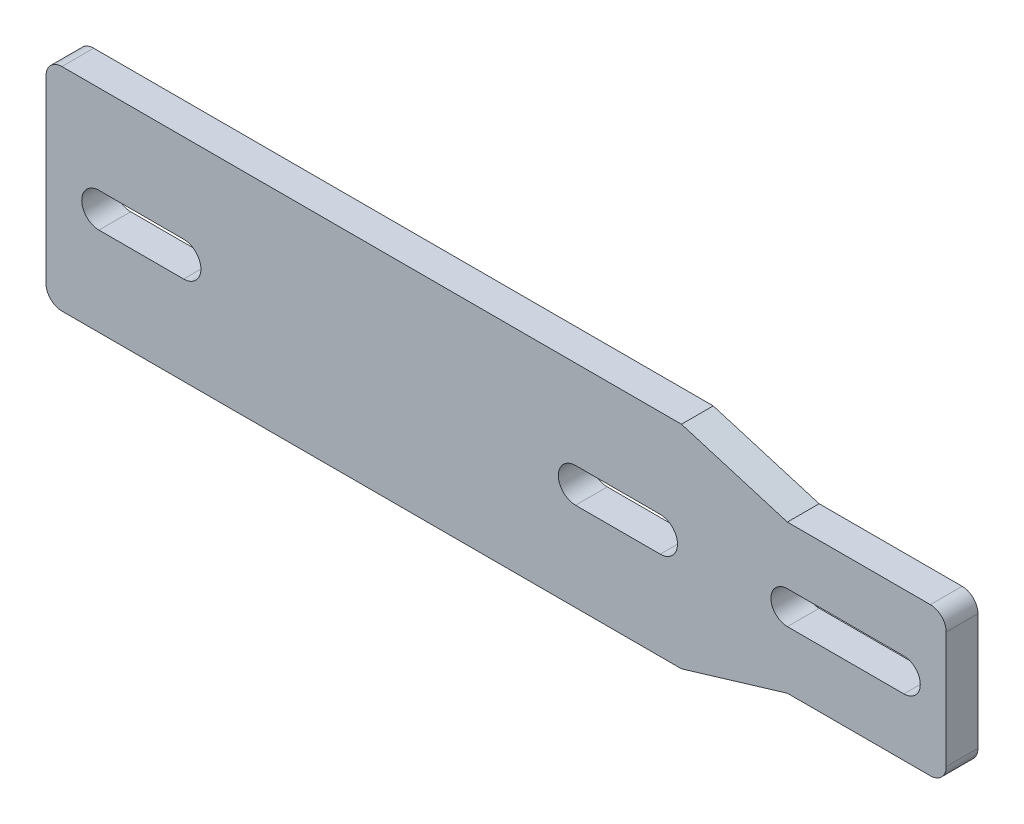
ISO-10303-21;
HEADER;
FILE_DESCRIPTION(('STEP AP214'),'2;1');
FILE_NAME('part.step','',(''),(''),'','','');
FILE_SCHEMA(('AUTOMOTIVE_DESIGN { 1 0 10303 214 1 1 1 1 }'));
ENDSEC;
DATA;
#1=APPLICATION_CONTEXT('core data for automotive mechanical design processes');
#2=APPLICATION_PROTOCOL_DEFINITION('international standard','automotive_design',2000,#1);
#3=PRODUCT_CONTEXT('',#1,'mechanical');
#4=PRODUCT('Part','Part','',(#3));
#5=PRODUCT_RELATED_PRODUCT_CATEGORY('part','',(#4));
#6=PRODUCT_DEFINITION_FORMATION('','',#4);
#7=PRODUCT_DEFINITION_CONTEXT('part definition',#1,'design');
#8=PRODUCT_DEFINITION('design','',#6,#7);
#9=PRODUCT_DEFINITION_SHAPE('','',#8);
#10=(LENGTH_UNIT() NAMED_UNIT(*) SI_UNIT(.MILLI.,.METRE.));
#11=(NAMED_UNIT(*) PLANE_ANGLE_UNIT() SI_UNIT($,.RADIAN.));
#12=(NAMED_UNIT(*) SI_UNIT($,.STERADIAN.) SOLID_ANGLE_UNIT());
#13=UNCERTAINTY_MEASURE_WITH_UNIT(LENGTH_MEASURE(1.E-05),#10,'distance_accuracy_value','');
#14=(GEOMETRIC_REPRESENTATION_CONTEXT(3) GLOBAL_UNCERTAINTY_ASSIGNED_CONTEXT((#13)) GLOBAL_UNIT_ASSIGNED_CONTEXT((#10,
#11,#12)) REPRESENTATION_CONTEXT('',''));
#15=CARTESIAN_POINT('',(0.,0.,0.));
#16=DIRECTION('',(0.,0.,1.));
#17=DIRECTION('',(1.,0.,0.));
#18=AXIS2_PLACEMENT_3D('',#15,#16,#17);
#19=CARTESIAN_POINT('',(0.,0.,6.));
#20=DIRECTION('',(1.,0.,0.));
#21=DIRECTION('',(0.,0.,-1.));
#22=AXIS2_PLACEMENT_3D('',#19,#20,#21);
#23=PLANE('',#22);
#24=DIRECTION('',(0.,-1.,0.));
#25=VECTOR('',#24,1.);
#26=CARTESIAN_POINT('',(0.,0.,6.));
#27=LINE('',#26,#25);
#28=CARTESIAN_POINT('',(0.,37.,6.));
#29=VERTEX_POINT('',#28);
#30=CARTESIAN_POINT('',(0.,3.,6.));
#31=VERTEX_POINT('',#30);
#32=EDGE_CURVE('E308',#29,#31,#27,.T.);
#33=ORIENTED_EDGE('',*,*,#32,.F.);
#34=DIRECTION('',(0.,0.,-1.));
#35=VECTOR('',#34,1.);
#36=CARTESIAN_POINT('',(0.,37.,6.));
#37=LINE('',#36,#35);
#38=CARTESIAN_POINT('',(0.,37.,0.));
#39=VERTEX_POINT('',#38);
#40=EDGE_CURVE('E359',#29,#39,#37,.T.);
#41=ORIENTED_EDGE('',*,*,#40,.T.);
#42=DIRECTION('',(0.,-1.,0.));
#43=VECTOR('',#42,1.);
#44=CARTESIAN_POINT('',(0.,0.,0.));
#45=LINE('',#44,#43);
#46=CARTESIAN_POINT('',(0.,3.,0.));
#47=VERTEX_POINT('',#46);
#48=EDGE_CURVE('E301',#39,#47,#45,.T.);
#49=ORIENTED_EDGE('',*,*,#48,.T.);
#50=DIRECTION('',(0.,0.,-1.));
#51=VECTOR('',#50,1.);
#52=CARTESIAN_POINT('',(0.,3.,6.));
#53=LINE('',#52,#51);
#54=EDGE_CURVE('E357',#47,#31,#53,.F.);
#55=ORIENTED_EDGE('',*,*,#54,.T.);
#56=EDGE_LOOP('',(#33,#41,#49,#55));
#57=FACE_BOUND('',#56,.T.);
#58=ADVANCED_FACE('F37',(#57),#23,.F.);
#59=CARTESIAN_POINT('',(0.,0.,6.));
#60=DIRECTION('',(0.,1.,0.));
#61=DIRECTION('',(-1.,0.,0.));
#62=AXIS2_PLACEMENT_3D('',#59,#60,#61);
#63=PLANE('',#62);
#64=DIRECTION('',(1.,0.,0.));
#65=VECTOR('',#64,1.);
#66=CARTESIAN_POINT('',(0.,0.,6.));
#67=LINE('',#66,#65);
#68=CARTESIAN_POINT('',(3.,0.,6.));
#69=VERTEX_POINT('',#68);
#70=CARTESIAN_POINT('',(120.,0.,6.));
#71=VERTEX_POINT('',#70);
#72=EDGE_CURVE('E311',#69,#71,#67,.T.);
#73=ORIENTED_EDGE('',*,*,#72,.F.);
#74=DIRECTION('',(0.,0.,-1.));
#75=VECTOR('',#74,1.);
#76=CARTESIAN_POINT('',(3.,0.,6.));
#77=LINE('',#76,#75);
#78=CARTESIAN_POINT('',(3.,0.,0.));
#79=VERTEX_POINT('',#78);
#80=EDGE_CURVE('E379',#69,#79,#77,.T.);
#81=ORIENTED_EDGE('',*,*,#80,.T.);
#82=DIRECTION('',(1.,0.,0.));
#83=VECTOR('',#82,1.);
#84=CARTESIAN_POINT('',(0.,0.,0.));
#85=LINE('',#84,#83);
#86=CARTESIAN_POINT('',(120.,0.,0.));
#87=VERTEX_POINT('',#86);
#88=EDGE_CURVE('E331',#79,#87,#85,.T.);
#89=ORIENTED_EDGE('',*,*,#88,.T.);
#90=DIRECTION('',(0.,0.,-1.));
#91=VECTOR('',#90,1.);
#92=CARTESIAN_POINT('',(120.,0.,6.));
#93=LINE('',#92,#91);
#94=EDGE_CURVE('E354',#71,#87,#93,.T.);
#95=ORIENTED_EDGE('',*,*,#94,.F.);
#96=EDGE_LOOP('',(#73,#81,#89,#95));
#97=FACE_BOUND('',#96,.T.);
#98=ADVANCED_FACE('F431',(#97),#63,.F.);
#99=CARTESIAN_POINT('',(140.,6.,6.));
#100=DIRECTION('',(-0.287347885566345,0.957826285221151,0.));
#101=DIRECTION('',(-0.957826285221152,-0.287347885566345,0.));
#102=AXIS2_PLACEMENT_3D('',#99,#100,#101);
#103=PLANE('',#102);
#104=DIRECTION('',(0.957826285221151,0.287347885566345,0.));
#105=VECTOR('',#104,1.);
#106=CARTESIAN_POINT('',(140.,6.,0.));
#107=LINE('',#106,#105);
#108=CARTESIAN_POINT('',(140.,6.,0.));
#109=VERTEX_POINT('',#108);
#110=EDGE_CURVE('E333',#87,#109,#107,.T.);
#111=ORIENTED_EDGE('',*,*,#110,.T.);
#112=DIRECTION('',(0.,0.,-1.));
#113=VECTOR('',#112,1.);
#114=CARTESIAN_POINT('',(140.,6.,6.));
#115=LINE('',#114,#113);
#116=CARTESIAN_POINT('',(140.,6.,6.));
#117=VERTEX_POINT('',#116);
#118=EDGE_CURVE('E351',#117,#109,#115,.T.);
#119=ORIENTED_EDGE('',*,*,#118,.F.);
#120=DIRECTION('',(0.957826285221151,0.287347885566345,0.));
#121=VECTOR('',#120,1.);
#122=CARTESIAN_POINT('',(140.,6.,6.));
#123=LINE('',#122,#121);
#124=EDGE_CURVE('E314',#71,#117,#123,.T.);
#125=ORIENTED_EDGE('',*,*,#124,.F.);
#126=ORIENTED_EDGE('',*,*,#94,.T.);
#127=EDGE_LOOP('',(#111,#119,#125,#126));
#128=FACE_BOUND('',#127,.T.);
#129=ADVANCED_FACE('F435',(#128),#103,.F.);
#130=CARTESIAN_POINT('',(170.,6.,6.));
#131=DIRECTION('',(0.,1.,0.));
#132=DIRECTION('',(-1.,0.,0.));
#133=AXIS2_PLACEMENT_3D('',#130,#131,#132);
#134=PLANE('',#133);
#135=DIRECTION('',(1.,0.,0.));
#136=VECTOR('',#135,1.);
#137=CARTESIAN_POINT('',(170.,6.,0.));
#138=LINE('',#137,#136);
#139=CARTESIAN_POINT('',(167.,6.,0.));
#140=VERTEX_POINT('',#139);
#141=EDGE_CURVE('E335',#109,#140,#138,.T.);
#142=ORIENTED_EDGE('',*,*,#141,.T.);
#143=DIRECTION('',(0.,0.,-1.));
#144=VECTOR('',#143,1.);
#145=CARTESIAN_POINT('',(167.,6.,6.));
#146=LINE('',#145,#144);
#147=CARTESIAN_POINT('',(167.,6.,6.));
#148=VERTEX_POINT('',#147);
#149=EDGE_CURVE('E45',#140,#148,#146,.F.);
#150=ORIENTED_EDGE('',*,*,#149,.T.);
#151=DIRECTION('',(1.,0.,0.));
#152=VECTOR('',#151,1.);
#153=CARTESIAN_POINT('',(170.,6.,6.));
#154=LINE('',#153,#152);
#155=EDGE_CURVE('E316',#117,#148,#154,.T.);
#156=ORIENTED_EDGE('',*,*,#155,.F.);
#157=ORIENTED_EDGE('',*,*,#118,.T.);
#158=EDGE_LOOP('',(#142,#150,#156,#157));
#159=FACE_BOUND('',#158,.T.);
#160=ADVANCED_FACE('F388',(#159),#134,.F.);
#161=CARTESIAN_POINT('',(170.,34.,6.));
#162=DIRECTION('',(-1.,0.,0.));
#163=DIRECTION('',(0.,0.,1.));
#164=AXIS2_PLACEMENT_3D('',#161,#162,#163);
#165=PLANE('',#164);
#166=DIRECTION('',(0.,1.,0.));
#167=VECTOR('',#166,1.);
#168=CARTESIAN_POINT('',(170.,34.,6.));
#169=LINE('',#168,#167);
#170=CARTESIAN_POINT('',(170.,9.,6.));
#171=VERTEX_POINT('',#170);
#172=CARTESIAN_POINT('',(170.,31.,6.));
#173=VERTEX_POINT('',#172);
#174=EDGE_CURVE('E319',#171,#173,#169,.T.);
#175=ORIENTED_EDGE('',*,*,#174,.F.);
#176=DIRECTION('',(0.,0.,-1.));
#177=VECTOR('',#176,1.);
#178=CARTESIAN_POINT('',(170.,9.,6.));
#179=LINE('',#178,#177);
#180=CARTESIAN_POINT('',(170.,9.,0.));
#181=VERTEX_POINT('',#180);
#182=EDGE_CURVE('E383',#171,#181,#179,.T.);
#183=ORIENTED_EDGE('',*,*,#182,.T.);
#184=DIRECTION('',(0.,1.,0.));
#185=VECTOR('',#184,1.);
#186=CARTESIAN_POINT('',(170.,34.,0.));
#187=LINE('',#186,#185);
#188=CARTESIAN_POINT('',(170.,31.,0.));
#189=VERTEX_POINT('',#188);
#190=EDGE_CURVE('E338',#181,#189,#187,.T.);
#191=ORIENTED_EDGE('',*,*,#190,.T.);
#192=DIRECTION('',(0.,0.,-1.));
#193=VECTOR('',#192,1.);
#194=CARTESIAN_POINT('',(170.,31.,6.));
#195=LINE('',#194,#193);
#196=EDGE_CURVE('E60',#189,#173,#195,.F.);
#197=ORIENTED_EDGE('',*,*,#196,.T.);
#198=EDGE_LOOP('',(#175,#183,#191,#197));
#199=FACE_BOUND('',#198,.T.);
#200=ADVANCED_FACE('F398',(#199),#165,.F.);
#201=CARTESIAN_POINT('',(140.,34.,6.));
#202=DIRECTION('',(0.,-1.,0.));
#203=DIRECTION('',(0.,0.,-1.));
#204=AXIS2_PLACEMENT_3D('',#201,#202,#203);
#205=PLANE('',#204);
#206=DIRECTION('',(-1.,0.,0.));
#207=VECTOR('',#206,1.);
#208=CARTESIAN_POINT('',(140.,34.,6.));
#209=LINE('',#208,#207);
#210=CARTESIAN_POINT('',(167.,34.,6.));
#211=VERTEX_POINT('',#210);
#212=CARTESIAN_POINT('',(140.,34.,6.));
#213=VERTEX_POINT('',#212);
#214=EDGE_CURVE('E321',#211,#213,#209,.T.);
#215=ORIENTED_EDGE('',*,*,#214,.F.);
#216=DIRECTION('',(0.,0.,-1.));
#217=VECTOR('',#216,1.);
#218=CARTESIAN_POINT('',(167.,34.,6.));
#219=LINE('',#218,#217);
#220=CARTESIAN_POINT('',(167.,34.,0.));
#221=VERTEX_POINT('',#220);
#222=EDGE_CURVE('E11',#211,#221,#219,.T.);
#223=ORIENTED_EDGE('',*,*,#222,.T.);
#224=DIRECTION('',(-1.,0.,0.));
#225=VECTOR('',#224,1.);
#226=CARTESIAN_POINT('',(140.,34.,0.));
#227=LINE('',#226,#225);
#228=CARTESIAN_POINT('',(140.,34.,0.));
#229=VERTEX_POINT('',#228);
#230=EDGE_CURVE('E340',#221,#229,#227,.T.);
#231=ORIENTED_EDGE('',*,*,#230,.T.);
#232=DIRECTION('',(0.,0.,-1.));
#233=VECTOR('',#232,1.);
#234=CARTESIAN_POINT('',(140.,34.,6.));
#235=LINE('',#234,#233);
#236=EDGE_CURVE('E348',#213,#229,#235,.T.);
#237=ORIENTED_EDGE('',*,*,#236,.F.);
#238=EDGE_LOOP('',(#215,#223,#231,#237));
#239=FACE_BOUND('',#238,.T.);
#240=ADVANCED_FACE('F406',(#239),#205,.F.);
#241=CARTESIAN_POINT('',(120.,40.,6.));
#242=DIRECTION('',(-0.287347885566345,-0.957826285221151,0.));
#243=DIRECTION('',(0.957826285221152,-0.287347885566345,0.));
#244=AXIS2_PLACEMENT_3D('',#241,#242,#243);
#245=PLANE('',#244);
#246=DIRECTION('',(-0.957826285221151,0.287347885566345,0.));
#247=VECTOR('',#246,1.);
#248=CARTESIAN_POINT('',(120.,40.,0.));
#249=LINE('',#248,#247);
#250=CARTESIAN_POINT('',(120.,40.,0.));
#251=VERTEX_POINT('',#250);
#252=EDGE_CURVE('E342',#229,#251,#249,.T.);
#253=ORIENTED_EDGE('',*,*,#252,.T.);
#254=DIRECTION('',(0.,0.,-1.));
#255=VECTOR('',#254,1.);
#256=CARTESIAN_POINT('',(120.,40.,6.));
#257=LINE('',#256,#255);
#258=CARTESIAN_POINT('',(120.,40.,6.));
#259=VERTEX_POINT('',#258);
#260=EDGE_CURVE('E328',#259,#251,#257,.T.);
#261=ORIENTED_EDGE('',*,*,#260,.F.);
#262=DIRECTION('',(-0.957826285221151,0.287347885566345,0.));
#263=VECTOR('',#262,1.);
#264=CARTESIAN_POINT('',(120.,40.,6.));
#265=LINE('',#264,#263);
#266=EDGE_CURVE('E323',#213,#259,#265,.T.);
#267=ORIENTED_EDGE('',*,*,#266,.F.);
#268=ORIENTED_EDGE('',*,*,#236,.T.);
#269=EDGE_LOOP('',(#253,#261,#267,#268));
#270=FACE_BOUND('',#269,.T.);
#271=ADVANCED_FACE('F413',(#270),#245,.F.);
#272=CARTESIAN_POINT('',(0.,40.,6.));
#273=DIRECTION('',(0.,-1.,0.));
#274=DIRECTION('',(0.,0.,-1.));
#275=AXIS2_PLACEMENT_3D('',#272,#273,#274);
#276=PLANE('',#275);
#277=DIRECTION('',(-1.,0.,0.));
#278=VECTOR('',#277,1.);
#279=CARTESIAN_POINT('',(0.,40.,0.));
#280=LINE('',#279,#278);
#281=CARTESIAN_POINT('',(3.,40.,0.));
#282=VERTEX_POINT('',#281);
#283=EDGE_CURVE('E312',#251,#282,#280,.T.);
#284=ORIENTED_EDGE('',*,*,#283,.T.);
#285=DIRECTION('',(0.,0.,-1.));
#286=VECTOR('',#285,1.);
#287=CARTESIAN_POINT('',(3.,40.,6.));
#288=LINE('',#287,#286);
#289=CARTESIAN_POINT('',(3.,40.,6.));
#290=VERTEX_POINT('',#289);
#291=EDGE_CURVE('E370',#282,#290,#288,.F.);
#292=ORIENTED_EDGE('',*,*,#291,.T.);
#293=DIRECTION('',(-1.,0.,0.));
#294=VECTOR('',#293,1.);
#295=CARTESIAN_POINT('',(0.,40.,6.));
#296=LINE('',#295,#294);
#297=EDGE_CURVE('E325',#259,#290,#296,.T.);
#298=ORIENTED_EDGE('',*,*,#297,.F.);
#299=ORIENTED_EDGE('',*,*,#260,.T.);
#300=EDGE_LOOP('',(#284,#292,#298,#299));
#301=FACE_BOUND('',#300,.T.);
#302=ADVANCED_FACE('F416',(#301),#276,.F.);
#303=CARTESIAN_POINT('',(0.,0.,6.));
#304=DIRECTION('',(0.,0.,-1.));
#305=DIRECTION('',(-1.,0.,0.));
#306=AXIS2_PLACEMENT_3D('',#303,#304,#305);
#307=PLANE('',#306);
#308=DIRECTION('',(1.,0.,0.));
#309=VECTOR('',#308,1.);
#310=CARTESIAN_POINT('',(100.,16.75,6.));
#311=LINE('',#310,#309);
#312=CARTESIAN_POINT('',(100.,16.75,6.));
#313=VERTEX_POINT('',#312);
#314=CARTESIAN_POINT('',(116.,16.75,6.));
#315=VERTEX_POINT('',#314);
#316=EDGE_CURVE('E234',#313,#315,#311,.T.);
#317=ORIENTED_EDGE('',*,*,#316,.F.);
#318=CARTESIAN_POINT('',(100.,20.,6.));
#319=DIRECTION('',(0.,0.,1.));
#320=DIRECTION('',(1.,0.,0.));
#321=AXIS2_PLACEMENT_3D('',#318,#319,#320);
#322=CIRCLE('',#321,3.25);
#323=CARTESIAN_POINT('',(100.,23.25,6.));
#324=VERTEX_POINT('',#323);
#325=EDGE_CURVE('E207',#324,#313,#322,.T.);
#326=ORIENTED_EDGE('',*,*,#325,.F.);
#327=DIRECTION('',(-1.,0.,0.));
#328=VECTOR('',#327,1.);
#329=CARTESIAN_POINT('',(100.,23.25,6.));
#330=LINE('',#329,#328);
#331=CARTESIAN_POINT('',(116.,23.25,6.));
#332=VERTEX_POINT('',#331);
#333=EDGE_CURVE('E225',#332,#324,#330,.T.);
#334=ORIENTED_EDGE('',*,*,#333,.F.);
#335=CARTESIAN_POINT('',(116.,20.,6.));
#336=DIRECTION('',(0.,0.,1.));
#337=DIRECTION('',(1.,0.,0.));
#338=AXIS2_PLACEMENT_3D('',#335,#336,#337);
#339=CIRCLE('',#338,3.25);
#340=EDGE_CURVE('E228',#315,#332,#339,.T.);
#341=ORIENTED_EDGE('',*,*,#340,.F.);
#342=EDGE_LOOP('',(#317,#326,#334,#341));
#343=FACE_BOUND('',#342,.T.);
#344=DIRECTION('',(1.,0.,0.));
#345=VECTOR('',#344,1.);
#346=CARTESIAN_POINT('',(140.,16.9,6.));
#347=LINE('',#346,#345);
#348=CARTESIAN_POINT('',(140.,16.9,6.));
#349=VERTEX_POINT('',#348);
#350=CARTESIAN_POINT('',(162.,16.9,6.));
#351=VERTEX_POINT('',#350);
#352=EDGE_CURVE('E259',#349,#351,#347,.T.);
#353=ORIENTED_EDGE('',*,*,#352,.F.);
#354=CARTESIAN_POINT('',(140.,20.,6.));
#355=DIRECTION('',(0.,0.,1.));
#356=DIRECTION('',(1.,0.,0.));
#357=AXIS2_PLACEMENT_3D('',#354,#355,#356);
#358=CIRCLE('',#357,3.1);
#359=CARTESIAN_POINT('',(140.,23.1,6.));
#360=VERTEX_POINT('',#359);
#361=EDGE_CURVE('E240',#360,#349,#358,.T.);
#362=ORIENTED_EDGE('',*,*,#361,.F.);
#363=DIRECTION('',(-1.,0.,0.));
#364=VECTOR('',#363,1.);
#365=CARTESIAN_POINT('',(140.,23.1,6.));
#366=LINE('',#365,#364);
#367=CARTESIAN_POINT('',(162.,23.1,6.));
#368=VERTEX_POINT('',#367);
#369=EDGE_CURVE('E248',#368,#360,#366,.T.);
#370=ORIENTED_EDGE('',*,*,#369,.F.);
#371=CARTESIAN_POINT('',(162.,20.,6.));
#372=DIRECTION('',(0.,0.,1.));
#373=DIRECTION('',(1.,0.,0.));
#374=AXIS2_PLACEMENT_3D('',#371,#372,#373);
#375=CIRCLE('',#374,3.1);
#376=EDGE_CURVE('E262',#351,#368,#375,.T.);
#377=ORIENTED_EDGE('',*,*,#376,.F.);
#378=EDGE_LOOP('',(#353,#362,#370,#377));
#379=FACE_BOUND('',#378,.T.);
#380=DIRECTION('',(1.,0.,0.));
#381=VECTOR('',#380,1.);
#382=CARTESIAN_POINT('',(10.,16.75,6.));
#383=LINE('',#382,#381);
#384=CARTESIAN_POINT('',(10.,16.75,6.));
#385=VERTEX_POINT('',#384);
#386=CARTESIAN_POINT('',(26.,16.75,6.));
#387=VERTEX_POINT('',#386);
#388=EDGE_CURVE('E291',#385,#387,#383,.T.);
#389=ORIENTED_EDGE('',*,*,#388,.F.);
#390=CARTESIAN_POINT('',(10.,20.,6.));
#391=DIRECTION('',(0.,0.,1.));
#392=DIRECTION('',(1.,0.,0.));
#393=AXIS2_PLACEMENT_3D('',#390,#391,#392);
#394=CIRCLE('',#393,3.25);
#395=CARTESIAN_POINT('',(10.,23.25,6.));
#396=VERTEX_POINT('',#395);
#397=EDGE_CURVE('E269',#396,#385,#394,.T.);
#398=ORIENTED_EDGE('',*,*,#397,.F.);
#399=DIRECTION('',(-1.,0.,0.));
#400=VECTOR('',#399,1.);
#401=CARTESIAN_POINT('',(10.,23.25,6.));
#402=LINE('',#401,#400);
#403=CARTESIAN_POINT('',(26.,23.25,6.));
#404=VERTEX_POINT('',#403);
#405=EDGE_CURVE('E280',#404,#396,#402,.T.);
#406=ORIENTED_EDGE('',*,*,#405,.F.);
#407=CARTESIAN_POINT('',(26.,20.,6.));
#408=DIRECTION('',(0.,0.,1.));
#409=DIRECTION('',(1.,0.,0.));
#410=AXIS2_PLACEMENT_3D('',#407,#408,#409);
#411=CIRCLE('',#410,3.25);
#412=EDGE_CURVE('E294',#387,#404,#411,.T.);
#413=ORIENTED_EDGE('',*,*,#412,.F.);
#414=EDGE_LOOP('',(#389,#398,#406,#413));
#415=FACE_BOUND('',#414,.T.);
#416=ORIENTED_EDGE('',*,*,#297,.T.);
#417=CARTESIAN_POINT('',(3.,37.,6.));
#418=DIRECTION('',(0.,0.,-1.));
#419=DIRECTION('',(-1.,0.,0.));
#420=AXIS2_PLACEMENT_3D('',#417,#418,#419);
#421=CIRCLE('',#420,3.);
#422=EDGE_CURVE('E377',#290,#29,#421,.F.);
#423=ORIENTED_EDGE('',*,*,#422,.T.);
#424=ORIENTED_EDGE('',*,*,#32,.T.);
#425=CARTESIAN_POINT('',(3.,3.,6.));
#426=DIRECTION('',(0.,0.,-1.));
#427=DIRECTION('',(-1.,0.,0.));
#428=AXIS2_PLACEMENT_3D('',#425,#426,#427);
#429=CIRCLE('',#428,3.);
#430=EDGE_CURVE('E375',#31,#69,#429,.F.);
#431=ORIENTED_EDGE('',*,*,#430,.T.);
#432=ORIENTED_EDGE('',*,*,#72,.T.);
#433=ORIENTED_EDGE('',*,*,#124,.T.);
#434=ORIENTED_EDGE('',*,*,#155,.T.);
#435=CARTESIAN_POINT('',(167.,9.,6.));
#436=DIRECTION('',(0.,0.,-1.));
#437=DIRECTION('',(-1.,0.,0.));
#438=AXIS2_PLACEMENT_3D('',#435,#436,#437);
#439=CIRCLE('',#438,3.);
#440=EDGE_CURVE('E373',#148,#171,#439,.F.);
#441=ORIENTED_EDGE('',*,*,#440,.T.);
#442=ORIENTED_EDGE('',*,*,#174,.T.);
#443=CARTESIAN_POINT('',(167.,31.,6.));
#444=DIRECTION('',(0.,0.,-1.));
#445=DIRECTION('',(-1.,0.,0.));
#446=AXIS2_PLACEMENT_3D('',#443,#444,#445);
#447=CIRCLE('',#446,3.);
#448=EDGE_CURVE('E52',#173,#211,#447,.F.);
#449=ORIENTED_EDGE('',*,*,#448,.T.);
#450=ORIENTED_EDGE('',*,*,#214,.T.);
#451=ORIENTED_EDGE('',*,*,#266,.T.);
#452=EDGE_LOOP('',(#416,#423,#424,#431,#432,#433,#434,#441,#442,#449,#450,#451));
#453=FACE_BOUND('',#452,.T.);
#454=ADVANCED_FACE('F392',(#343,#379,#415,#453),#307,.F.);
#455=CARTESIAN_POINT('',(0.,0.,0.));
#456=DIRECTION('',(0.,0.,-1.));
#457=DIRECTION('',(-1.,0.,0.));
#458=AXIS2_PLACEMENT_3D('',#455,#456,#457);
#459=PLANE('',#458);
#460=CARTESIAN_POINT('',(100.,20.,0.));
#461=DIRECTION('',(0.,0.,1.));
#462=DIRECTION('',(1.,0.,0.));
#463=AXIS2_PLACEMENT_3D('',#460,#461,#462);
#464=CIRCLE('',#463,3.25);
#465=CARTESIAN_POINT('',(100.,23.25,0.));
#466=VERTEX_POINT('',#465);
#467=CARTESIAN_POINT('',(100.,16.75,0.));
#468=VERTEX_POINT('',#467);
#469=EDGE_CURVE('E204',#466,#468,#464,.T.);
#470=ORIENTED_EDGE('',*,*,#469,.T.);
#471=DIRECTION('',(1.,0.,0.));
#472=VECTOR('',#471,1.);
#473=CARTESIAN_POINT('',(100.,16.75,0.));
#474=LINE('',#473,#472);
#475=CARTESIAN_POINT('',(116.,16.75,0.));
#476=VERTEX_POINT('',#475);
#477=EDGE_CURVE('E216',#468,#476,#474,.T.);
#478=ORIENTED_EDGE('',*,*,#477,.T.);
#479=CARTESIAN_POINT('',(116.,20.,0.));
#480=DIRECTION('',(0.,0.,1.));
#481=DIRECTION('',(1.,0.,0.));
#482=AXIS2_PLACEMENT_3D('',#479,#480,#481);
#483=CIRCLE('',#482,3.25);
#484=CARTESIAN_POINT('',(116.,23.25,0.));
#485=VERTEX_POINT('',#484);
#486=EDGE_CURVE('E220',#476,#485,#483,.T.);
#487=ORIENTED_EDGE('',*,*,#486,.T.);
#488=DIRECTION('',(-1.,0.,0.));
#489=VECTOR('',#488,1.);
#490=CARTESIAN_POINT('',(100.,23.25,0.));
#491=LINE('',#490,#489);
#492=EDGE_CURVE('E212',#485,#466,#491,.T.);
#493=ORIENTED_EDGE('',*,*,#492,.T.);
#494=EDGE_LOOP('',(#470,#478,#487,#493));
#495=FACE_BOUND('',#494,.T.);
#496=CARTESIAN_POINT('',(140.,20.,0.));
#497=DIRECTION('',(0.,0.,1.));
#498=DIRECTION('',(1.,0.,0.));
#499=AXIS2_PLACEMENT_3D('',#496,#497,#498);
#500=CIRCLE('',#499,3.1);
#501=CARTESIAN_POINT('',(140.,23.1,0.));
#502=VERTEX_POINT('',#501);
#503=CARTESIAN_POINT('',(140.,16.9,0.));
#504=VERTEX_POINT('',#503);
#505=EDGE_CURVE('E244',#502,#504,#500,.T.);
#506=ORIENTED_EDGE('',*,*,#505,.T.);
#507=DIRECTION('',(1.,0.,0.));
#508=VECTOR('',#507,1.);
#509=CARTESIAN_POINT('',(140.,16.9,0.));
#510=LINE('',#509,#508);
#511=CARTESIAN_POINT('',(162.,16.9,0.));
#512=VERTEX_POINT('',#511);
#513=EDGE_CURVE('E247',#504,#512,#510,.T.);
#514=ORIENTED_EDGE('',*,*,#513,.T.);
#515=CARTESIAN_POINT('',(162.,20.,0.));
#516=DIRECTION('',(0.,0.,1.));
#517=DIRECTION('',(1.,0.,0.));
#518=AXIS2_PLACEMENT_3D('',#515,#516,#517);
#519=CIRCLE('',#518,3.1);
#520=CARTESIAN_POINT('',(162.,23.1,0.));
#521=VERTEX_POINT('',#520);
#522=EDGE_CURVE('E251',#512,#521,#519,.T.);
#523=ORIENTED_EDGE('',*,*,#522,.T.);
#524=DIRECTION('',(-1.,0.,0.));
#525=VECTOR('',#524,1.);
#526=CARTESIAN_POINT('',(140.,23.1,0.));
#527=LINE('',#526,#525);
#528=EDGE_CURVE('E254',#521,#502,#527,.T.);
#529=ORIENTED_EDGE('',*,*,#528,.T.);
#530=EDGE_LOOP('',(#506,#514,#523,#529));
#531=FACE_BOUND('',#530,.T.);
#532=CARTESIAN_POINT('',(10.,20.,0.));
#533=DIRECTION('',(0.,0.,1.));
#534=DIRECTION('',(1.,0.,0.));
#535=AXIS2_PLACEMENT_3D('',#532,#533,#534);
#536=CIRCLE('',#535,3.25);
#537=CARTESIAN_POINT('',(10.,23.25,0.));
#538=VERTEX_POINT('',#537);
#539=CARTESIAN_POINT('',(10.,16.75,0.));
#540=VERTEX_POINT('',#539);
#541=EDGE_CURVE('E276',#538,#540,#536,.T.);
#542=ORIENTED_EDGE('',*,*,#541,.T.);
#543=DIRECTION('',(1.,0.,0.));
#544=VECTOR('',#543,1.);
#545=CARTESIAN_POINT('',(10.,16.75,0.));
#546=LINE('',#545,#544);
#547=CARTESIAN_POINT('',(26.,16.75,0.));
#548=VERTEX_POINT('',#547);
#549=EDGE_CURVE('E279',#540,#548,#546,.T.);
#550=ORIENTED_EDGE('',*,*,#549,.T.);
#551=CARTESIAN_POINT('',(26.,20.,0.));
#552=DIRECTION('',(0.,0.,1.));
#553=DIRECTION('',(1.,0.,0.));
#554=AXIS2_PLACEMENT_3D('',#551,#552,#553);
#555=CIRCLE('',#554,3.25);
#556=CARTESIAN_POINT('',(26.,23.25,0.));
#557=VERTEX_POINT('',#556);
#558=EDGE_CURVE('E283',#548,#557,#555,.T.);
#559=ORIENTED_EDGE('',*,*,#558,.T.);
#560=DIRECTION('',(-1.,0.,0.));
#561=VECTOR('',#560,1.);
#562=CARTESIAN_POINT('',(10.,23.25,0.));
#563=LINE('',#562,#561);
#564=EDGE_CURVE('E286',#557,#538,#563,.T.);
#565=ORIENTED_EDGE('',*,*,#564,.T.);
#566=EDGE_LOOP('',(#542,#550,#559,#565));
#567=FACE_BOUND('',#566,.T.);
#568=ORIENTED_EDGE('',*,*,#48,.F.);
#569=CARTESIAN_POINT('',(3.,37.,0.));
#570=DIRECTION('',(0.,0.,-1.));
#571=DIRECTION('',(-1.,0.,0.));
#572=AXIS2_PLACEMENT_3D('',#569,#570,#571);
#573=CIRCLE('',#572,3.);
#574=EDGE_CURVE('E368',#39,#282,#573,.T.);
#575=ORIENTED_EDGE('',*,*,#574,.T.);
#576=ORIENTED_EDGE('',*,*,#283,.F.);
#577=ORIENTED_EDGE('',*,*,#252,.F.);
#578=ORIENTED_EDGE('',*,*,#230,.F.);
#579=CARTESIAN_POINT('',(167.,31.,0.));
#580=DIRECTION('',(0.,0.,-1.));
#581=DIRECTION('',(-1.,0.,0.));
#582=AXIS2_PLACEMENT_3D('',#579,#580,#581);
#583=CIRCLE('',#582,3.);
#584=EDGE_CURVE('E362',#221,#189,#583,.T.);
#585=ORIENTED_EDGE('',*,*,#584,.T.);
#586=ORIENTED_EDGE('',*,*,#190,.F.);
#587=CARTESIAN_POINT('',(167.,9.,0.));
#588=DIRECTION('',(0.,0.,-1.));
#589=DIRECTION('',(-1.,0.,0.));
#590=AXIS2_PLACEMENT_3D('',#587,#588,#589);
#591=CIRCLE('',#590,3.);
#592=EDGE_CURVE('E364',#181,#140,#591,.T.);
#593=ORIENTED_EDGE('',*,*,#592,.T.);
#594=ORIENTED_EDGE('',*,*,#141,.F.);
#595=ORIENTED_EDGE('',*,*,#110,.F.);
#596=ORIENTED_EDGE('',*,*,#88,.F.);
#597=CARTESIAN_POINT('',(3.,3.,0.));
#598=DIRECTION('',(0.,0.,-1.));
#599=DIRECTION('',(-1.,0.,0.));
#600=AXIS2_PLACEMENT_3D('',#597,#598,#599);
#601=CIRCLE('',#600,3.);
#602=EDGE_CURVE('E366',#79,#47,#601,.T.);
#603=ORIENTED_EDGE('',*,*,#602,.T.);
#604=EDGE_LOOP('',(#568,#575,#576,#577,#578,#585,#586,#593,#594,#595,#596,#603));
#605=FACE_BOUND('',#604,.T.);
#606=ADVANCED_FACE('F222',(#495,#531,#567,#605),#459,.T.);
#607=CARTESIAN_POINT('',(10.,20.,0.));
#608=DIRECTION('',(0.,0.,1.));
#609=DIRECTION('',(1.,0.,0.));
#610=AXIS2_PLACEMENT_3D('',#607,#608,#609);
#611=CYLINDRICAL_SURFACE('',#610,3.25);
#612=ORIENTED_EDGE('',*,*,#397,.T.);
#613=DIRECTION('',(0.,0.,1.));
#614=VECTOR('',#613,1.);
#615=CARTESIAN_POINT('',(10.,16.75,0.));
#616=LINE('',#615,#614);
#617=EDGE_CURVE('E289',#540,#385,#616,.T.);
#618=ORIENTED_EDGE('',*,*,#617,.F.);
#619=ORIENTED_EDGE('',*,*,#541,.F.);
#620=DIRECTION('',(0.,0.,1.));
#621=VECTOR('',#620,1.);
#622=CARTESIAN_POINT('',(10.,23.25,0.));
#623=LINE('',#622,#621);
#624=EDGE_CURVE('E299',#538,#396,#623,.T.);
#625=ORIENTED_EDGE('',*,*,#624,.T.);
#626=EDGE_LOOP('',(#612,#618,#619,#625));
#627=FACE_BOUND('',#626,.T.);
#628=ADVANCED_FACE('F485',(#627),#611,.F.);
#629=CARTESIAN_POINT('',(10.,23.25,0.));
#630=DIRECTION('',(0.,1.,0.));
#631=DIRECTION('',(0.,0.,1.));
#632=AXIS2_PLACEMENT_3D('',#629,#630,#631);
#633=PLANE('',#632);
#634=ORIENTED_EDGE('',*,*,#405,.T.);
#635=ORIENTED_EDGE('',*,*,#624,.F.);
#636=ORIENTED_EDGE('',*,*,#564,.F.);
#637=DIRECTION('',(0.,0.,1.));
#638=VECTOR('',#637,1.);
#639=CARTESIAN_POINT('',(26.,23.25,0.));
#640=LINE('',#639,#638);
#641=EDGE_CURVE('E302',#557,#404,#640,.T.);
#642=ORIENTED_EDGE('',*,*,#641,.T.);
#643=EDGE_LOOP('',(#634,#635,#636,#642));
#644=FACE_BOUND('',#643,.T.);
#645=ADVANCED_FACE('F633',(#644),#633,.F.);
#646=CARTESIAN_POINT('',(26.,20.,0.));
#647=DIRECTION('',(0.,0.,1.));
#648=DIRECTION('',(1.,0.,0.));
#649=AXIS2_PLACEMENT_3D('',#646,#647,#648);
#650=CYLINDRICAL_SURFACE('',#649,3.25);
#651=ORIENTED_EDGE('',*,*,#412,.T.);
#652=ORIENTED_EDGE('',*,*,#641,.F.);
#653=ORIENTED_EDGE('',*,*,#558,.F.);
#654=DIRECTION('',(0.,0.,1.));
#655=VECTOR('',#654,1.);
#656=CARTESIAN_POINT('',(26.,16.75,0.));
#657=LINE('',#656,#655);
#658=EDGE_CURVE('E304',#548,#387,#657,.T.);
#659=ORIENTED_EDGE('',*,*,#658,.T.);
#660=EDGE_LOOP('',(#651,#652,#653,#659));
#661=FACE_BOUND('',#660,.T.);
#662=ADVANCED_FACE('F623',(#661),#650,.F.);
#663=CARTESIAN_POINT('',(10.,16.75,0.));
#664=DIRECTION('',(0.,-1.,0.));
#665=DIRECTION('',(0.,0.,-1.));
#666=AXIS2_PLACEMENT_3D('',#663,#664,#665);
#667=PLANE('',#666);
#668=ORIENTED_EDGE('',*,*,#388,.T.);
#669=ORIENTED_EDGE('',*,*,#658,.F.);
#670=ORIENTED_EDGE('',*,*,#549,.F.);
#671=ORIENTED_EDGE('',*,*,#617,.T.);
#672=EDGE_LOOP('',(#668,#669,#670,#671));
#673=FACE_BOUND('',#672,.T.);
#674=ADVANCED_FACE('F613',(#673),#667,.F.);
#675=CARTESIAN_POINT('',(140.,20.,0.));
#676=DIRECTION('',(0.,0.,1.));
#677=DIRECTION('',(1.,0.,0.));
#678=AXIS2_PLACEMENT_3D('',#675,#676,#677);
#679=CYLINDRICAL_SURFACE('',#678,3.1);
#680=ORIENTED_EDGE('',*,*,#361,.T.);
#681=DIRECTION('',(0.,0.,1.));
#682=VECTOR('',#681,1.);
#683=CARTESIAN_POINT('',(140.,16.9,0.));
#684=LINE('',#683,#682);
#685=EDGE_CURVE('E257',#504,#349,#684,.T.);
#686=ORIENTED_EDGE('',*,*,#685,.F.);
#687=ORIENTED_EDGE('',*,*,#505,.F.);
#688=DIRECTION('',(0.,0.,1.));
#689=VECTOR('',#688,1.);
#690=CARTESIAN_POINT('',(140.,23.1,0.));
#691=LINE('',#690,#689);
#692=EDGE_CURVE('E267',#502,#360,#691,.T.);
#693=ORIENTED_EDGE('',*,*,#692,.T.);
#694=EDGE_LOOP('',(#680,#686,#687,#693));
#695=FACE_BOUND('',#694,.T.);
#696=ADVANCED_FACE('F603',(#695),#679,.F.);
#697=CARTESIAN_POINT('',(140.,23.1,0.));
#698=DIRECTION('',(0.,1.,0.));
#699=DIRECTION('',(0.,0.,1.));
#700=AXIS2_PLACEMENT_3D('',#697,#698,#699);
#701=PLANE('',#700);
#702=ORIENTED_EDGE('',*,*,#369,.T.);
#703=ORIENTED_EDGE('',*,*,#692,.F.);
#704=ORIENTED_EDGE('',*,*,#528,.F.);
#705=DIRECTION('',(0.,0.,1.));
#706=VECTOR('',#705,1.);
#707=CARTESIAN_POINT('',(162.,23.1,0.));
#708=LINE('',#707,#706);
#709=EDGE_CURVE('E270',#521,#368,#708,.T.);
#710=ORIENTED_EDGE('',*,*,#709,.T.);
#711=EDGE_LOOP('',(#702,#703,#704,#710));
#712=FACE_BOUND('',#711,.T.);
#713=ADVANCED_FACE('F593',(#712),#701,.F.);
#714=CARTESIAN_POINT('',(162.,20.,0.));
#715=DIRECTION('',(0.,0.,1.));
#716=DIRECTION('',(1.,0.,0.));
#717=AXIS2_PLACEMENT_3D('',#714,#715,#716);
#718=CYLINDRICAL_SURFACE('',#717,3.1);
#719=ORIENTED_EDGE('',*,*,#376,.T.);
#720=ORIENTED_EDGE('',*,*,#709,.F.);
#721=ORIENTED_EDGE('',*,*,#522,.F.);
#722=DIRECTION('',(0.,0.,1.));
#723=VECTOR('',#722,1.);
#724=CARTESIAN_POINT('',(162.,16.9,0.));
#725=LINE('',#724,#723);
#726=EDGE_CURVE('E272',#512,#351,#725,.T.);
#727=ORIENTED_EDGE('',*,*,#726,.T.);
#728=EDGE_LOOP('',(#719,#720,#721,#727));
#729=FACE_BOUND('',#728,.T.);
#730=ADVANCED_FACE('F583',(#729),#718,.F.);
#731=CARTESIAN_POINT('',(140.,16.9,0.));
#732=DIRECTION('',(0.,-1.,0.));
#733=DIRECTION('',(0.,0.,-1.));
#734=AXIS2_PLACEMENT_3D('',#731,#732,#733);
#735=PLANE('',#734);
#736=ORIENTED_EDGE('',*,*,#352,.T.);
#737=ORIENTED_EDGE('',*,*,#726,.F.);
#738=ORIENTED_EDGE('',*,*,#513,.F.);
#739=ORIENTED_EDGE('',*,*,#685,.T.);
#740=EDGE_LOOP('',(#736,#737,#738,#739));
#741=FACE_BOUND('',#740,.T.);
#742=ADVANCED_FACE('F574',(#741),#735,.F.);
#743=CARTESIAN_POINT('',(100.,20.,0.));
#744=DIRECTION('',(0.,0.,1.));
#745=DIRECTION('',(1.,0.,0.));
#746=AXIS2_PLACEMENT_3D('',#743,#744,#745);
#747=CYLINDRICAL_SURFACE('',#746,3.25);
#748=ORIENTED_EDGE('',*,*,#325,.T.);
#749=DIRECTION('',(0.,0.,1.));
#750=VECTOR('',#749,1.);
#751=CARTESIAN_POINT('',(100.,16.75,0.));
#752=LINE('',#751,#750);
#753=EDGE_CURVE('E200',#468,#313,#752,.T.);
#754=ORIENTED_EDGE('',*,*,#753,.F.);
#755=ORIENTED_EDGE('',*,*,#469,.F.);
#756=DIRECTION('',(0.,0.,1.));
#757=VECTOR('',#756,1.);
#758=CARTESIAN_POINT('',(100.,23.25,0.));
#759=LINE('',#758,#757);
#760=EDGE_CURVE('E238',#466,#324,#759,.T.);
#761=ORIENTED_EDGE('',*,*,#760,.T.);
#762=EDGE_LOOP('',(#748,#754,#755,#761));
#763=FACE_BOUND('',#762,.T.);
#764=ADVANCED_FACE('F202',(#763),#747,.F.);
#765=CARTESIAN_POINT('',(100.,23.25,0.));
#766=DIRECTION('',(0.,1.,0.));
#767=DIRECTION('',(0.,0.,1.));
#768=AXIS2_PLACEMENT_3D('',#765,#766,#767);
#769=PLANE('',#768);
#770=ORIENTED_EDGE('',*,*,#333,.T.);
#771=ORIENTED_EDGE('',*,*,#760,.F.);
#772=ORIENTED_EDGE('',*,*,#492,.F.);
#773=DIRECTION('',(0.,0.,1.));
#774=VECTOR('',#773,1.);
#775=CARTESIAN_POINT('',(116.,23.25,0.));
#776=LINE('',#775,#774);
#777=EDGE_CURVE('E241',#485,#332,#776,.T.);
#778=ORIENTED_EDGE('',*,*,#777,.T.);
#779=EDGE_LOOP('',(#770,#771,#772,#778));
#780=FACE_BOUND('',#779,.T.);
#781=ADVANCED_FACE('F555',(#780),#769,.F.);
#782=CARTESIAN_POINT('',(116.,20.,0.));
#783=DIRECTION('',(0.,0.,1.));
#784=DIRECTION('',(1.,0.,0.));
#785=AXIS2_PLACEMENT_3D('',#782,#783,#784);
#786=CYLINDRICAL_SURFACE('',#785,3.25);
#787=ORIENTED_EDGE('',*,*,#340,.T.);
#788=ORIENTED_EDGE('',*,*,#777,.F.);
#789=ORIENTED_EDGE('',*,*,#486,.F.);
#790=DIRECTION('',(0.,0.,1.));
#791=VECTOR('',#790,1.);
#792=CARTESIAN_POINT('',(116.,16.75,0.));
#793=LINE('',#792,#791);
#794=EDGE_CURVE('E211',#476,#315,#793,.T.);
#795=ORIENTED_EDGE('',*,*,#794,.T.);
#796=EDGE_LOOP('',(#787,#788,#789,#795));
#797=FACE_BOUND('',#796,.T.);
#798=ADVANCED_FACE('F546',(#797),#786,.F.);
#799=CARTESIAN_POINT('',(100.,16.75,0.));
#800=DIRECTION('',(0.,-1.,0.));
#801=DIRECTION('',(0.,0.,-1.));
#802=AXIS2_PLACEMENT_3D('',#799,#800,#801);
#803=PLANE('',#802);
#804=ORIENTED_EDGE('',*,*,#316,.T.);
#805=ORIENTED_EDGE('',*,*,#794,.F.);
#806=ORIENTED_EDGE('',*,*,#477,.F.);
#807=ORIENTED_EDGE('',*,*,#753,.T.);
#808=EDGE_LOOP('',(#804,#805,#806,#807));
#809=FACE_BOUND('',#808,.T.);
#810=ADVANCED_FACE('F217',(#809),#803,.F.);
#811=CARTESIAN_POINT('',(3.,37.,6.));
#812=DIRECTION('',(0.,0.,-1.));
#813=DIRECTION('',(-1.,0.,0.));
#814=AXIS2_PLACEMENT_3D('',#811,#812,#813);
#815=CYLINDRICAL_SURFACE('',#814,3.);
#816=ORIENTED_EDGE('',*,*,#422,.F.);
#817=ORIENTED_EDGE('',*,*,#291,.F.);
#818=ORIENTED_EDGE('',*,*,#574,.F.);
#819=ORIENTED_EDGE('',*,*,#40,.F.);
#820=EDGE_LOOP('',(#816,#817,#818,#819));
#821=FACE_BOUND('',#820,.T.);
#822=ADVANCED_FACE('F419',(#821),#815,.T.);
#823=CARTESIAN_POINT('',(3.,3.,6.));
#824=DIRECTION('',(0.,0.,-1.));
#825=DIRECTION('',(-1.,0.,0.));
#826=AXIS2_PLACEMENT_3D('',#823,#824,#825);
#827=CYLINDRICAL_SURFACE('',#826,3.);
#828=ORIENTED_EDGE('',*,*,#430,.F.);
#829=ORIENTED_EDGE('',*,*,#54,.F.);
#830=ORIENTED_EDGE('',*,*,#602,.F.);
#831=ORIENTED_EDGE('',*,*,#80,.F.);
#832=EDGE_LOOP('',(#828,#829,#830,#831));
#833=FACE_BOUND('',#832,.T.);
#834=ADVANCED_FACE('F426',(#833),#827,.T.);
#835=CARTESIAN_POINT('',(167.,9.,6.));
#836=DIRECTION('',(0.,0.,-1.));
#837=DIRECTION('',(-1.,0.,0.));
#838=AXIS2_PLACEMENT_3D('',#835,#836,#837);
#839=CYLINDRICAL_SURFACE('',#838,3.);
#840=ORIENTED_EDGE('',*,*,#440,.F.);
#841=ORIENTED_EDGE('',*,*,#149,.F.);
#842=ORIENTED_EDGE('',*,*,#592,.F.);
#843=ORIENTED_EDGE('',*,*,#182,.F.);
#844=EDGE_LOOP('',(#840,#841,#842,#843));
#845=FACE_BOUND('',#844,.T.);
#846=ADVANCED_FACE('F396',(#845),#839,.T.);
#847=CARTESIAN_POINT('',(167.,31.,6.));
#848=DIRECTION('',(0.,0.,-1.));
#849=DIRECTION('',(-1.,0.,0.));
#850=AXIS2_PLACEMENT_3D('',#847,#848,#849);
#851=CYLINDRICAL_SURFACE('',#850,3.);
#852=ORIENTED_EDGE('',*,*,#448,.F.);
#853=ORIENTED_EDGE('',*,*,#196,.F.);
#854=ORIENTED_EDGE('',*,*,#584,.F.);
#855=ORIENTED_EDGE('',*,*,#222,.F.);
#856=EDGE_LOOP('',(#852,#853,#854,#855));
#857=FACE_BOUND('',#856,.T.);
#858=ADVANCED_FACE('F39',(#857),#851,.T.);
#859=CLOSED_SHELL('',(#58,#98,#129,#160,#200,#240,#271,#302,#454,#606,#628,#645,#662,#674,#696,
#713,#730,#742,#764,#781,#798,#810,#822,#834,#846,#858));
#860=MANIFOLD_SOLID_BREP('B2',#859);
#861=ADVANCED_BREP_SHAPE_REPRESENTATION('',(#18,#860),#14);
#862=SHAPE_DEFINITION_REPRESENTATION(#9,#861);
ENDSEC;
END-ISO-10303-21;
